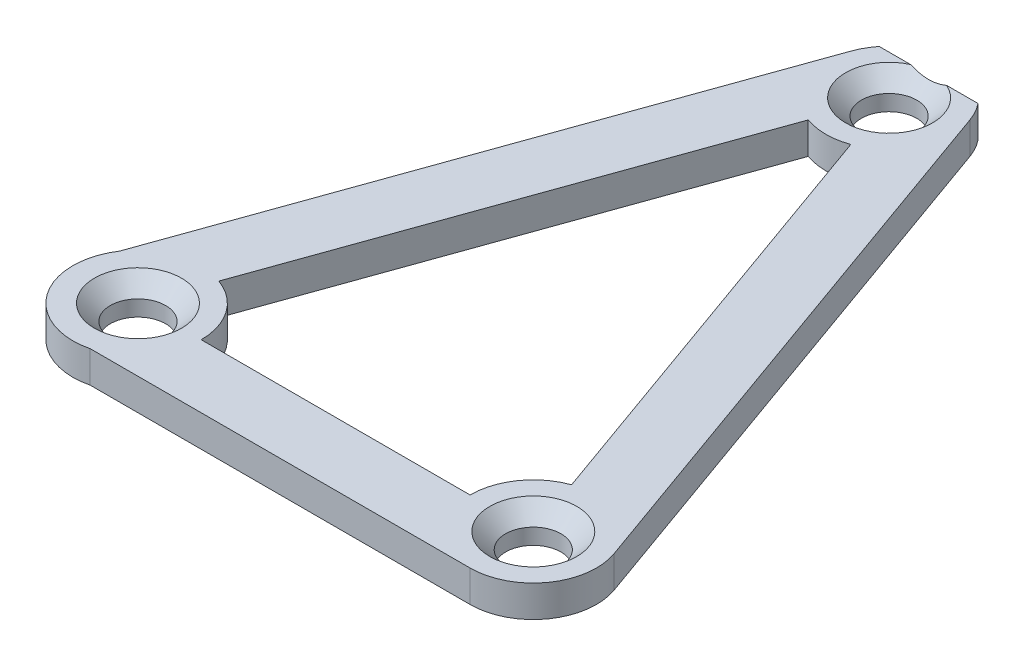
ISO-10303-21;
HEADER;
FILE_DESCRIPTION(('STEP AP214'),'2;1');
FILE_NAME('part.step','',(''),(''),'','','');
FILE_SCHEMA(('AUTOMOTIVE_DESIGN { 1 0 10303 214 1 1 1 1 }'));
ENDSEC;
DATA;
#1=APPLICATION_CONTEXT('core data for automotive mechanical design processes');
#2=APPLICATION_PROTOCOL_DEFINITION('international standard','automotive_design',2000,#1);
#3=PRODUCT_CONTEXT('',#1,'mechanical');
#4=PRODUCT('Part','Part','',(#3));
#5=PRODUCT_RELATED_PRODUCT_CATEGORY('part','',(#4));
#6=PRODUCT_DEFINITION_FORMATION('','',#4);
#7=PRODUCT_DEFINITION_CONTEXT('part definition',#1,'design');
#8=PRODUCT_DEFINITION('design','',#6,#7);
#9=PRODUCT_DEFINITION_SHAPE('','',#8);
#10=(LENGTH_UNIT() NAMED_UNIT(*) SI_UNIT(.MILLI.,.METRE.));
#11=(NAMED_UNIT(*) PLANE_ANGLE_UNIT() SI_UNIT($,.RADIAN.));
#12=(NAMED_UNIT(*) SI_UNIT($,.STERADIAN.) SOLID_ANGLE_UNIT());
#13=UNCERTAINTY_MEASURE_WITH_UNIT(LENGTH_MEASURE(1.E-05),#10,'distance_accuracy_value','');
#14=(GEOMETRIC_REPRESENTATION_CONTEXT(3) GLOBAL_UNCERTAINTY_ASSIGNED_CONTEXT((#13)) GLOBAL_UNIT_ASSIGNED_CONTEXT((#10,
#11,#12)) REPRESENTATION_CONTEXT('',''));
#15=CARTESIAN_POINT('',(0.,0.,0.));
#16=DIRECTION('',(0.,0.,1.));
#17=DIRECTION('',(1.,0.,0.));
#18=AXIS2_PLACEMENT_3D('',#15,#16,#17);
#19=CARTESIAN_POINT('',(15.8884942729655,2.,-41.3048119431263));
#20=DIRECTION('',(0.,-1.,0.));
#21=DIRECTION('',(0.,0.,-1.));
#22=AXIS2_PLACEMENT_3D('',#19,#20,#21);
#23=CYLINDRICAL_SURFACE('',#22,4.);
#24=CARTESIAN_POINT('',(15.8884942729655,0.,-41.3048119431263));
#25=DIRECTION('',(0.,1.,0.));
#26=DIRECTION('',(0.,0.,1.));
#27=AXIS2_PLACEMENT_3D('',#24,#25,#26);
#28=CIRCLE('',#27,4.);
#29=CARTESIAN_POINT('',(19.6554619193448,0.,-42.6501575311189));
#30=VERTEX_POINT('',#29);
#31=CARTESIAN_POINT('',(19.0109932721647,0.,-43.8048119431263));
#32=VERTEX_POINT('',#31);
#33=EDGE_CURVE('E188',#30,#32,#28,.T.);
#34=ORIENTED_EDGE('',*,*,#33,.T.);
#35=DIRECTION('',(0.,-1.,0.));
#36=VECTOR('',#35,1.);
#37=CARTESIAN_POINT('',(19.0109932721647,2.,-43.8048119431263));
#38=LINE('',#37,#36);
#39=CARTESIAN_POINT('',(19.0109932721647,2.,-43.8048119431263));
#40=VERTEX_POINT('',#39);
#41=EDGE_CURVE('E159',#32,#40,#38,.F.);
#42=ORIENTED_EDGE('',*,*,#41,.T.);
#43=CARTESIAN_POINT('',(15.8884942729655,2.,-41.3048119431263));
#44=DIRECTION('',(0.,1.,0.));
#45=DIRECTION('',(0.,0.,1.));
#46=AXIS2_PLACEMENT_3D('',#43,#44,#45);
#47=CIRCLE('',#46,4.);
#48=CARTESIAN_POINT('',(19.6554619193448,2.,-42.6501575311189));
#49=VERTEX_POINT('',#48);
#50=EDGE_CURVE('E166',#49,#40,#47,.T.);
#51=ORIENTED_EDGE('',*,*,#50,.F.);
#52=DIRECTION('',(0.,-1.,0.));
#53=VECTOR('',#52,1.);
#54=CARTESIAN_POINT('',(19.6554619193448,2.,-42.6501575311189));
#55=LINE('',#54,#53);
#56=EDGE_CURVE('E206',#49,#30,#55,.T.);
#57=ORIENTED_EDGE('',*,*,#56,.T.);
#58=EDGE_LOOP('',(#34,#42,#51,#57));
#59=FACE_BOUND('',#58,.T.);
#60=ADVANCED_FACE('F32',(#59),#23,.T.);
#61=CARTESIAN_POINT('',(28.3884942729655,2.,-6.30481194312627));
#62=DIRECTION('',(0.,1.,0.));
#63=DIRECTION('',(0.,0.,1.));
#64=AXIS2_PLACEMENT_3D('',#61,#62,#63);
#65=PLANE('',#64);
#66=DIRECTION('',(1.,0.,0.));
#67=VECTOR('',#66,1.);
#68=CARTESIAN_POINT('',(20.8884942729655,2.,-43.8048119431263));
#69=LINE('',#68,#67);
#70=CARTESIAN_POINT('',(12.7659952737663,2.,-43.8048119431263));
#71=VERTEX_POINT('',#70);
#72=CARTESIAN_POINT('',(14.7428503492265,2.,-43.8048119431263));
#73=VERTEX_POINT('',#72);
#74=EDGE_CURVE('E51',#71,#73,#69,.T.);
#75=ORIENTED_EDGE('',*,*,#74,.F.);
#76=CARTESIAN_POINT('',(12.1215266265861,2.,-42.6501575311189));
#77=VERTEX_POINT('',#76);
#78=EDGE_CURVE('E154',#71,#77,#47,.T.);
#79=ORIENTED_EDGE('',*,*,#78,.T.);
#80=DIRECTION('',(-0.336336396998156,0.,0.941741911594838));
#81=VECTOR('',#80,1.);
#82=CARTESIAN_POINT('',(-0.0497651199511386,2.,-8.5705406408145));
#83=LINE('',#82,#81);
#84=CARTESIAN_POINT('',(-0.0497651199511395,2.,-8.5705406408145));
#85=VERTEX_POINT('',#84);
#86=EDGE_CURVE('E170',#77,#85,#83,.T.);
#87=ORIENTED_EDGE('',*,*,#86,.T.);
#88=CARTESIAN_POINT('',(3.38849427296549,2.,-6.30481194312627));
#89=DIRECTION('',(0.,1.,0.));
#90=DIRECTION('',(0.,0.,1.));
#91=AXIS2_PLACEMENT_3D('',#88,#89,#90);
#92=CIRCLE('',#91,4.11766368035412);
#93=CARTESIAN_POINT('',(4.36581417172305,2.,-2.30481194312627));
#94=VERTEX_POINT('',#93);
#95=EDGE_CURVE('E176',#85,#94,#92,.T.);
#96=ORIENTED_EDGE('',*,*,#95,.T.);
#97=DIRECTION('',(1.,0.,0.));
#98=VECTOR('',#97,1.);
#99=CARTESIAN_POINT('',(28.3884942729655,2.,-2.30481194312628));
#100=LINE('',#99,#98);
#101=CARTESIAN_POINT('',(28.3884942729655,2.,-2.30481194312628));
#102=VERTEX_POINT('',#101);
#103=EDGE_CURVE('E178',#94,#102,#100,.T.);
#104=ORIENTED_EDGE('',*,*,#103,.T.);
#105=CARTESIAN_POINT('',(28.3884942729655,2.,-6.30481194312627));
#106=DIRECTION('',(0.,1.,0.));
#107=DIRECTION('',(0.,0.,1.));
#108=AXIS2_PLACEMENT_3D('',#105,#106,#107);
#109=CIRCLE('',#108,4.);
#110=CARTESIAN_POINT('',(32.1554619193448,2.,-7.65015753111889));
#111=VERTEX_POINT('',#110);
#112=EDGE_CURVE('E171',#102,#111,#109,.T.);
#113=ORIENTED_EDGE('',*,*,#112,.T.);
#114=DIRECTION('',(-0.336336396998156,0.,-0.941741911594838));
#115=VECTOR('',#114,1.);
#116=CARTESIAN_POINT('',(19.6554619193448,2.,-42.6501575311189));
#117=LINE('',#116,#115);
#118=EDGE_CURVE('E167',#111,#49,#117,.T.);
#119=ORIENTED_EDGE('',*,*,#118,.T.);
#120=ORIENTED_EDGE('',*,*,#50,.T.);
#121=CARTESIAN_POINT('',(17.0341381967045,2.,-43.8048119431263));
#122=VERTEX_POINT('',#121);
#123=EDGE_CURVE('E160',#122,#40,#69,.T.);
#124=ORIENTED_EDGE('',*,*,#123,.F.);
#125=CARTESIAN_POINT('',(15.8884942729655,2.,-41.3048119431263));
#126=DIRECTION('',(0.,1.,0.));
#127=DIRECTION('',(0.,0.,1.));
#128=AXIS2_PLACEMENT_3D('',#125,#126,#127);
#129=CIRCLE('',#128,2.75000000000002);
#130=EDGE_CURVE('E158',#122,#73,#129,.F.);
#131=ORIENTED_EDGE('',*,*,#130,.T.);
#132=EDGE_LOOP('',(#75,#79,#87,#96,#104,#113,#119,#120,#124,#131));
#133=FACE_BOUND('',#132,.T.);
#134=CARTESIAN_POINT('',(3.38849427296549,2.,-6.30481194312627));
#135=DIRECTION('',(0.,1.,0.));
#136=DIRECTION('',(0.,0.,1.));
#137=AXIS2_PLACEMENT_3D('',#134,#135,#136);
#138=CIRCLE('',#137,2.75000000000002);
#139=CARTESIAN_POINT('',(3.38849427296549,2.,-3.55481194312626));
#140=VERTEX_POINT('',#139);
#141=EDGE_CURVE('E218',#140,#140,#138,.F.);
#142=ORIENTED_EDGE('',*,*,#141,.T.);
#143=EDGE_LOOP('',(#142));
#144=FACE_BOUND('',#143,.T.);
#145=CARTESIAN_POINT('',(28.3884942729655,2.,-6.30481194312627));
#146=DIRECTION('',(0.,1.,0.));
#147=DIRECTION('',(0.,0.,1.));
#148=AXIS2_PLACEMENT_3D('',#145,#146,#147);
#149=CIRCLE('',#148,2.75000000000002);
#150=CARTESIAN_POINT('',(28.3884942729655,2.,-3.55481194312626));
#151=VERTEX_POINT('',#150);
#152=EDGE_CURVE('E215',#151,#151,#149,.F.);
#153=ORIENTED_EDGE('',*,*,#152,.T.);
#154=EDGE_LOOP('',(#153));
#155=FACE_BOUND('',#154,.T.);
#156=DIRECTION('',(-0.336336396998156,0.,0.941741911594837));
#157=VECTOR('',#156,1.);
#158=CARTESIAN_POINT('',(14.5431486849729,2.,-37.5378442967469));
#159=LINE('',#158,#157);
#160=CARTESIAN_POINT('',(14.5431486849729,2.,-37.5378442967469));
#161=VERTEX_POINT('',#160);
#162=CARTESIAN_POINT('',(4.73383986095812,2.,-10.0717795895056));
#163=VERTEX_POINT('',#162);
#164=EDGE_CURVE('E313',#161,#163,#159,.T.);
#165=ORIENTED_EDGE('',*,*,#164,.F.);
#166=CARTESIAN_POINT('',(15.8884942729655,2.,-41.3048119431263));
#167=DIRECTION('',(0.,-1.,0.));
#168=DIRECTION('',(0.,0.,1.));
#169=AXIS2_PLACEMENT_3D('',#166,#167,#168);
#170=CIRCLE('',#169,4.);
#171=CARTESIAN_POINT('',(17.2338398609581,2.,-37.5378442967469));
#172=VERTEX_POINT('',#171);
#173=EDGE_CURVE('E311',#172,#161,#170,.T.);
#174=ORIENTED_EDGE('',*,*,#173,.F.);
#175=DIRECTION('',(-0.336336396998156,0.,-0.941741911594837));
#176=VECTOR('',#175,1.);
#177=CARTESIAN_POINT('',(17.2338398609581,2.,-37.5378442967469));
#178=LINE('',#177,#176);
#179=CARTESIAN_POINT('',(27.0431486849729,2.,-10.0717795895056));
#180=VERTEX_POINT('',#179);
#181=EDGE_CURVE('E322',#180,#172,#178,.T.);
#182=ORIENTED_EDGE('',*,*,#181,.F.);
#183=CARTESIAN_POINT('',(28.3884942729655,2.,-6.30481194312627));
#184=DIRECTION('',(0.,-1.,0.));
#185=DIRECTION('',(0.,0.,1.));
#186=AXIS2_PLACEMENT_3D('',#183,#184,#185);
#187=CIRCLE('',#186,4.);
#188=CARTESIAN_POINT('',(24.3884942729655,2.,-6.30481194312628));
#189=VERTEX_POINT('',#188);
#190=EDGE_CURVE('E320',#189,#180,#187,.T.);
#191=ORIENTED_EDGE('',*,*,#190,.F.);
#192=DIRECTION('',(1.,0.,0.));
#193=VECTOR('',#192,1.);
#194=CARTESIAN_POINT('',(7.38849427296549,2.,-6.30481194312628));
#195=LINE('',#194,#193);
#196=CARTESIAN_POINT('',(7.38849427296549,2.,-6.30481194312628));
#197=VERTEX_POINT('',#196);
#198=EDGE_CURVE('E318',#197,#189,#195,.T.);
#199=ORIENTED_EDGE('',*,*,#198,.F.);
#200=CARTESIAN_POINT('',(3.38849427296549,2.,-6.30481194312627));
#201=DIRECTION('',(0.,-1.,0.));
#202=DIRECTION('',(0.,0.,1.));
#203=AXIS2_PLACEMENT_3D('',#200,#201,#202);
#204=CIRCLE('',#203,4.);
#205=EDGE_CURVE('E316',#163,#197,#204,.T.);
#206=ORIENTED_EDGE('',*,*,#205,.F.);
#207=EDGE_LOOP('',(#165,#174,#182,#191,#199,#206));
#208=FACE_BOUND('',#207,.T.);
#209=ADVANCED_FACE('F152',(#133,#144,#155,#208),#65,.T.);
#210=CARTESIAN_POINT('',(28.3884942729655,0.,-6.30481194312627));
#211=DIRECTION('',(0.,1.,0.));
#212=DIRECTION('',(0.,0.,1.));
#213=AXIS2_PLACEMENT_3D('',#210,#211,#212);
#214=PLANE('',#213);
#215=CARTESIAN_POINT('',(15.8884942729655,0.,-41.3048119431263));
#216=DIRECTION('',(0.,1.,0.));
#217=DIRECTION('',(0.,0.,1.));
#218=AXIS2_PLACEMENT_3D('',#215,#216,#217);
#219=CIRCLE('',#218,1.75);
#220=CARTESIAN_POINT('',(15.8884942729655,0.,-39.5548119431263));
#221=VERTEX_POINT('',#220);
#222=EDGE_CURVE('E285',#221,#221,#219,.T.);
#223=ORIENTED_EDGE('',*,*,#222,.T.);
#224=EDGE_LOOP('',(#223));
#225=FACE_BOUND('',#224,.T.);
#226=CARTESIAN_POINT('',(28.3884942729655,0.,-6.30481194312627));
#227=DIRECTION('',(0.,1.,0.));
#228=DIRECTION('',(0.,0.,1.));
#229=AXIS2_PLACEMENT_3D('',#226,#227,#228);
#230=CIRCLE('',#229,1.75);
#231=CARTESIAN_POINT('',(28.3884942729655,0.,-4.55481194312627));
#232=VERTEX_POINT('',#231);
#233=EDGE_CURVE('E287',#232,#232,#230,.T.);
#234=ORIENTED_EDGE('',*,*,#233,.T.);
#235=EDGE_LOOP('',(#234));
#236=FACE_BOUND('',#235,.T.);
#237=CARTESIAN_POINT('',(3.38849427296549,0.,-6.30481194312627));
#238=DIRECTION('',(0.,1.,0.));
#239=DIRECTION('',(0.,0.,1.));
#240=AXIS2_PLACEMENT_3D('',#237,#238,#239);
#241=CIRCLE('',#240,1.75);
#242=CARTESIAN_POINT('',(3.38849427296549,0.,-4.55481194312627));
#243=VERTEX_POINT('',#242);
#244=EDGE_CURVE('E185',#243,#243,#241,.T.);
#245=ORIENTED_EDGE('',*,*,#244,.T.);
#246=EDGE_LOOP('',(#245));
#247=FACE_BOUND('',#246,.T.);
#248=CARTESIAN_POINT('',(12.7659952737663,0.,-43.8048119431263));
#249=VERTEX_POINT('',#248);
#250=CARTESIAN_POINT('',(12.1215266265861,0.,-42.6501575311189));
#251=VERTEX_POINT('',#250);
#252=EDGE_CURVE('E187',#249,#251,#28,.T.);
#253=ORIENTED_EDGE('',*,*,#252,.F.);
#254=DIRECTION('',(1.,0.,0.));
#255=VECTOR('',#254,1.);
#256=CARTESIAN_POINT('',(28.3884942729655,0.,-43.8048119431263));
#257=LINE('',#256,#255);
#258=EDGE_CURVE('E144',#249,#32,#257,.T.);
#259=ORIENTED_EDGE('',*,*,#258,.T.);
#260=ORIENTED_EDGE('',*,*,#33,.F.);
#261=DIRECTION('',(-0.336336396998156,0.,-0.941741911594838));
#262=VECTOR('',#261,1.);
#263=CARTESIAN_POINT('',(19.6554619193448,0.,-42.6501575311189));
#264=LINE('',#263,#262);
#265=CARTESIAN_POINT('',(32.1554619193448,0.,-7.65015753111889));
#266=VERTEX_POINT('',#265);
#267=EDGE_CURVE('E184',#266,#30,#264,.T.);
#268=ORIENTED_EDGE('',*,*,#267,.F.);
#269=CARTESIAN_POINT('',(28.3884942729655,0.,-6.30481194312627));
#270=DIRECTION('',(0.,1.,0.));
#271=DIRECTION('',(0.,0.,1.));
#272=AXIS2_PLACEMENT_3D('',#269,#270,#271);
#273=CIRCLE('',#272,4.);
#274=CARTESIAN_POINT('',(28.3884942729655,0.,-2.30481194312628));
#275=VERTEX_POINT('',#274);
#276=EDGE_CURVE('E181',#275,#266,#273,.T.);
#277=ORIENTED_EDGE('',*,*,#276,.F.);
#278=DIRECTION('',(1.,0.,0.));
#279=VECTOR('',#278,1.);
#280=CARTESIAN_POINT('',(28.3884942729655,0.,-2.30481194312628));
#281=LINE('',#280,#279);
#282=CARTESIAN_POINT('',(4.36581417172305,0.,-2.30481194312627));
#283=VERTEX_POINT('',#282);
#284=EDGE_CURVE('E195',#283,#275,#281,.T.);
#285=ORIENTED_EDGE('',*,*,#284,.F.);
#286=CARTESIAN_POINT('',(3.38849427296549,0.,-6.30481194312627));
#287=DIRECTION('',(0.,1.,0.));
#288=DIRECTION('',(0.,0.,1.));
#289=AXIS2_PLACEMENT_3D('',#286,#287,#288);
#290=CIRCLE('',#289,4.11766368035412);
#291=CARTESIAN_POINT('',(-0.0497651199511395,0.,-8.5705406408145));
#292=VERTEX_POINT('',#291);
#293=EDGE_CURVE('E193',#292,#283,#290,.T.);
#294=ORIENTED_EDGE('',*,*,#293,.F.);
#295=DIRECTION('',(-0.336336396998156,0.,0.941741911594838));
#296=VECTOR('',#295,1.);
#297=CARTESIAN_POINT('',(-0.0497651199511386,0.,-8.5705406408145));
#298=LINE('',#297,#296);
#299=EDGE_CURVE('E191',#251,#292,#298,.T.);
#300=ORIENTED_EDGE('',*,*,#299,.F.);
#301=EDGE_LOOP('',(#253,#259,#260,#268,#277,#285,#294,#300));
#302=FACE_BOUND('',#301,.T.);
#303=CARTESIAN_POINT('',(15.8884942729655,0.,-41.3048119431263));
#304=DIRECTION('',(0.,-1.,0.));
#305=DIRECTION('',(0.,0.,1.));
#306=AXIS2_PLACEMENT_3D('',#303,#304,#305);
#307=CIRCLE('',#306,4.);
#308=CARTESIAN_POINT('',(17.2338398609581,0.,-37.5378442967469));
#309=VERTEX_POINT('',#308);
#310=CARTESIAN_POINT('',(14.5431486849729,0.,-37.5378442967469));
#311=VERTEX_POINT('',#310);
#312=EDGE_CURVE('E148',#309,#311,#307,.T.);
#313=ORIENTED_EDGE('',*,*,#312,.T.);
#314=DIRECTION('',(-0.336336396998156,0.,0.941741911594837));
#315=VECTOR('',#314,1.);
#316=CARTESIAN_POINT('',(14.5431486849729,0.,-37.5378442967469));
#317=LINE('',#316,#315);
#318=CARTESIAN_POINT('',(4.73383986095812,0.,-10.0717795895056));
#319=VERTEX_POINT('',#318);
#320=EDGE_CURVE('E327',#311,#319,#317,.T.);
#321=ORIENTED_EDGE('',*,*,#320,.T.);
#322=CARTESIAN_POINT('',(3.38849427296549,0.,-6.30481194312627));
#323=DIRECTION('',(0.,-1.,0.));
#324=DIRECTION('',(0.,0.,1.));
#325=AXIS2_PLACEMENT_3D('',#322,#323,#324);
#326=CIRCLE('',#325,4.);
#327=CARTESIAN_POINT('',(7.38849427296549,0.,-6.30481194312628));
#328=VERTEX_POINT('',#327);
#329=EDGE_CURVE('E330',#319,#328,#326,.T.);
#330=ORIENTED_EDGE('',*,*,#329,.T.);
#331=DIRECTION('',(1.,0.,0.));
#332=VECTOR('',#331,1.);
#333=CARTESIAN_POINT('',(7.38849427296549,0.,-6.30481194312628));
#334=LINE('',#333,#332);
#335=CARTESIAN_POINT('',(24.3884942729655,0.,-6.30481194312628));
#336=VERTEX_POINT('',#335);
#337=EDGE_CURVE('E333',#328,#336,#334,.T.);
#338=ORIENTED_EDGE('',*,*,#337,.T.);
#339=CARTESIAN_POINT('',(28.3884942729655,0.,-6.30481194312627));
#340=DIRECTION('',(0.,-1.,0.));
#341=DIRECTION('',(0.,0.,1.));
#342=AXIS2_PLACEMENT_3D('',#339,#340,#341);
#343=CIRCLE('',#342,4.);
#344=CARTESIAN_POINT('',(27.0431486849729,0.,-10.0717795895056));
#345=VERTEX_POINT('',#344);
#346=EDGE_CURVE('E336',#336,#345,#343,.T.);
#347=ORIENTED_EDGE('',*,*,#346,.T.);
#348=DIRECTION('',(-0.336336396998156,0.,-0.941741911594837));
#349=VECTOR('',#348,1.);
#350=CARTESIAN_POINT('',(17.2338398609581,0.,-37.5378442967469));
#351=LINE('',#350,#349);
#352=EDGE_CURVE('E314',#345,#309,#351,.T.);
#353=ORIENTED_EDGE('',*,*,#352,.T.);
#354=EDGE_LOOP('',(#313,#321,#330,#338,#347,#353));
#355=FACE_BOUND('',#354,.T.);
#356=ADVANCED_FACE('F246',(#225,#236,#247,#302,#355),#214,.F.);
#357=CARTESIAN_POINT('',(28.3884942729655,2.,-6.30481194312627));
#358=DIRECTION('',(0.,-1.,0.));
#359=DIRECTION('',(0.,0.,-1.));
#360=AXIS2_PLACEMENT_3D('',#357,#358,#359);
#361=CYLINDRICAL_SURFACE('',#360,4.);
#362=ORIENTED_EDGE('',*,*,#276,.T.);
#363=DIRECTION('',(0.,-1.,0.));
#364=VECTOR('',#363,1.);
#365=CARTESIAN_POINT('',(32.1554619193448,2.,-7.65015753111889));
#366=LINE('',#365,#364);
#367=EDGE_CURVE('E209',#111,#266,#366,.T.);
#368=ORIENTED_EDGE('',*,*,#367,.F.);
#369=ORIENTED_EDGE('',*,*,#112,.F.);
#370=DIRECTION('',(0.,-1.,0.));
#371=VECTOR('',#370,1.);
#372=CARTESIAN_POINT('',(28.3884942729655,2.,-2.30481194312628));
#373=LINE('',#372,#371);
#374=EDGE_CURVE('E180',#102,#275,#373,.T.);
#375=ORIENTED_EDGE('',*,*,#374,.T.);
#376=EDGE_LOOP('',(#362,#368,#369,#375));
#377=FACE_BOUND('',#376,.T.);
#378=ADVANCED_FACE('F259',(#377),#361,.T.);
#379=CARTESIAN_POINT('',(19.6554619193448,2.,-42.6501575311189));
#380=DIRECTION('',(-0.941741911594838,0.,0.336336396998156));
#381=DIRECTION('',(0.336336396998156,0.,0.941741911594838));
#382=AXIS2_PLACEMENT_3D('',#379,#380,#381);
#383=PLANE('',#382);
#384=ORIENTED_EDGE('',*,*,#267,.T.);
#385=ORIENTED_EDGE('',*,*,#56,.F.);
#386=ORIENTED_EDGE('',*,*,#118,.F.);
#387=ORIENTED_EDGE('',*,*,#367,.T.);
#388=EDGE_LOOP('',(#384,#385,#386,#387));
#389=FACE_BOUND('',#388,.T.);
#390=ADVANCED_FACE('F252',(#389),#383,.F.);
#391=ORIENTED_EDGE('',*,*,#78,.F.);
#392=DIRECTION('',(0.,-1.,0.));
#393=VECTOR('',#392,1.);
#394=CARTESIAN_POINT('',(12.7659952737663,2.,-43.8048119431263));
#395=LINE('',#394,#393);
#396=EDGE_CURVE('E141',#71,#249,#395,.T.);
#397=ORIENTED_EDGE('',*,*,#396,.T.);
#398=ORIENTED_EDGE('',*,*,#252,.T.);
#399=DIRECTION('',(0.,-1.,0.));
#400=VECTOR('',#399,1.);
#401=CARTESIAN_POINT('',(12.1215266265861,2.,-42.6501575311189));
#402=LINE('',#401,#400);
#403=EDGE_CURVE('E164',#77,#251,#402,.T.);
#404=ORIENTED_EDGE('',*,*,#403,.F.);
#405=EDGE_LOOP('',(#391,#397,#398,#404));
#406=FACE_BOUND('',#405,.T.);
#407=ADVANCED_FACE('F162',(#406),#23,.T.);
#408=CARTESIAN_POINT('',(-0.0497651199511386,2.,-8.5705406408145));
#409=DIRECTION('',(0.941741911594838,0.,0.336336396998156));
#410=DIRECTION('',(0.336336396998156,0.,-0.941741911594838));
#411=AXIS2_PLACEMENT_3D('',#408,#409,#410);
#412=PLANE('',#411);
#413=ORIENTED_EDGE('',*,*,#299,.T.);
#414=DIRECTION('',(0.,-1.,0.));
#415=VECTOR('',#414,1.);
#416=CARTESIAN_POINT('',(-0.0497651199511395,2.,-8.5705406408145));
#417=LINE('',#416,#415);
#418=EDGE_CURVE('E202',#85,#292,#417,.T.);
#419=ORIENTED_EDGE('',*,*,#418,.F.);
#420=ORIENTED_EDGE('',*,*,#86,.F.);
#421=ORIENTED_EDGE('',*,*,#403,.T.);
#422=EDGE_LOOP('',(#413,#419,#420,#421));
#423=FACE_BOUND('',#422,.T.);
#424=ADVANCED_FACE('F251',(#423),#412,.F.);
#425=CARTESIAN_POINT('',(3.38849427296549,2.,-6.30481194312627));
#426=DIRECTION('',(0.,-1.,0.));
#427=DIRECTION('',(0.,0.,-1.));
#428=AXIS2_PLACEMENT_3D('',#425,#426,#427);
#429=CYLINDRICAL_SURFACE('',#428,4.11766368035412);
#430=ORIENTED_EDGE('',*,*,#293,.T.);
#431=DIRECTION('',(0.,-1.,0.));
#432=VECTOR('',#431,1.);
#433=CARTESIAN_POINT('',(4.36581417172305,2.,-2.30481194312627));
#434=LINE('',#433,#432);
#435=EDGE_CURVE('E199',#94,#283,#434,.T.);
#436=ORIENTED_EDGE('',*,*,#435,.F.);
#437=ORIENTED_EDGE('',*,*,#95,.F.);
#438=ORIENTED_EDGE('',*,*,#418,.T.);
#439=EDGE_LOOP('',(#430,#436,#437,#438));
#440=FACE_BOUND('',#439,.T.);
#441=ADVANCED_FACE('F257',(#440),#429,.T.);
#442=CARTESIAN_POINT('',(28.3884942729655,2.,-2.30481194312628));
#443=DIRECTION('',(0.,0.,-1.));
#444=DIRECTION('',(-1.,0.,0.));
#445=AXIS2_PLACEMENT_3D('',#442,#443,#444);
#446=PLANE('',#445);
#447=ORIENTED_EDGE('',*,*,#284,.T.);
#448=ORIENTED_EDGE('',*,*,#374,.F.);
#449=ORIENTED_EDGE('',*,*,#103,.F.);
#450=ORIENTED_EDGE('',*,*,#435,.T.);
#451=EDGE_LOOP('',(#447,#448,#449,#450));
#452=FACE_BOUND('',#451,.T.);
#453=ADVANCED_FACE('F388',(#452),#446,.F.);
#454=CARTESIAN_POINT('',(3.38849427296549,2.,-6.30481194312627));
#455=DIRECTION('',(0.,-1.,0.));
#456=DIRECTION('',(0.,0.,-1.));
#457=AXIS2_PLACEMENT_3D('',#454,#455,#456);
#458=CYLINDRICAL_SURFACE('',#457,1.75);
#459=CARTESIAN_POINT('',(3.38849427296549,0.999999999999991,-6.30481194312627));
#460=DIRECTION('',(0.,1.,0.));
#461=DIRECTION('',(0.,0.,1.));
#462=AXIS2_PLACEMENT_3D('',#459,#460,#461);
#463=CIRCLE('',#462,1.75);
#464=CARTESIAN_POINT('',(3.38849427296549,0.999999999999991,-4.55481194312627));
#465=VERTEX_POINT('',#464);
#466=EDGE_CURVE('E222',#465,#465,#463,.T.);
#467=ORIENTED_EDGE('',*,*,#466,.T.);
#468=EDGE_LOOP('',(#467));
#469=FACE_BOUND('',#468,.T.);
#470=ORIENTED_EDGE('',*,*,#244,.F.);
#471=EDGE_LOOP('',(#470));
#472=FACE_BOUND('',#471,.T.);
#473=ADVANCED_FACE('F386',(#469,#472),#458,.F.);
#474=CARTESIAN_POINT('',(28.3884942729655,2.,-6.30481194312627));
#475=DIRECTION('',(0.,-1.,0.));
#476=DIRECTION('',(0.,0.,-1.));
#477=AXIS2_PLACEMENT_3D('',#474,#475,#476);
#478=CYLINDRICAL_SURFACE('',#477,1.75);
#479=CARTESIAN_POINT('',(28.3884942729655,0.999999999999992,-6.30481194312627));
#480=DIRECTION('',(0.,1.,0.));
#481=DIRECTION('',(0.,0.,1.));
#482=AXIS2_PLACEMENT_3D('',#479,#480,#481);
#483=CIRCLE('',#482,1.75);
#484=CARTESIAN_POINT('',(28.3884942729655,0.999999999999992,-4.55481194312627));
#485=VERTEX_POINT('',#484);
#486=EDGE_CURVE('E45',#485,#485,#483,.T.);
#487=ORIENTED_EDGE('',*,*,#486,.T.);
#488=EDGE_LOOP('',(#487));
#489=FACE_BOUND('',#488,.T.);
#490=ORIENTED_EDGE('',*,*,#233,.F.);
#491=EDGE_LOOP('',(#490));
#492=FACE_BOUND('',#491,.T.);
#493=ADVANCED_FACE('F227',(#489,#492),#478,.F.);
#494=CARTESIAN_POINT('',(15.8884942729655,2.,-41.3048119431263));
#495=DIRECTION('',(0.,-1.,0.));
#496=DIRECTION('',(0.,0.,-1.));
#497=AXIS2_PLACEMENT_3D('',#494,#495,#496);
#498=CYLINDRICAL_SURFACE('',#497,1.75);
#499=CARTESIAN_POINT('',(15.8884942729655,0.999999999999978,-41.3048119431263));
#500=DIRECTION('',(0.,1.,0.));
#501=DIRECTION('',(0.,0.,1.));
#502=AXIS2_PLACEMENT_3D('',#499,#500,#501);
#503=CIRCLE('',#502,1.75);
#504=CARTESIAN_POINT('',(15.8884942729655,0.999999999999978,-39.5548119431263));
#505=VERTEX_POINT('',#504);
#506=EDGE_CURVE('E212',#505,#505,#503,.T.);
#507=ORIENTED_EDGE('',*,*,#506,.T.);
#508=EDGE_LOOP('',(#507));
#509=FACE_BOUND('',#508,.T.);
#510=ORIENTED_EDGE('',*,*,#222,.F.);
#511=EDGE_LOOP('',(#510));
#512=FACE_BOUND('',#511,.T.);
#513=ADVANCED_FACE('F278',(#509,#512),#498,.F.);
#514=CARTESIAN_POINT('',(15.8884942729655,2.,-41.3048119431263));
#515=DIRECTION('',(0.,-1.,0.));
#516=DIRECTION('',(0.,0.,-1.));
#517=AXIS2_PLACEMENT_3D('',#514,#515,#516);
#518=CYLINDRICAL_SURFACE('',#517,4.);
#519=ORIENTED_EDGE('',*,*,#312,.F.);
#520=DIRECTION('',(0.,-1.,0.));
#521=VECTOR('',#520,1.);
#522=CARTESIAN_POINT('',(17.2338398609581,2.,-37.5378442967469));
#523=LINE('',#522,#521);
#524=EDGE_CURVE('E324',#172,#309,#523,.T.);
#525=ORIENTED_EDGE('',*,*,#524,.F.);
#526=ORIENTED_EDGE('',*,*,#173,.T.);
#527=DIRECTION('',(0.,-1.,0.));
#528=VECTOR('',#527,1.);
#529=CARTESIAN_POINT('',(14.5431486849729,2.,-37.5378442967469));
#530=LINE('',#529,#528);
#531=EDGE_CURVE('E288',#161,#311,#530,.T.);
#532=ORIENTED_EDGE('',*,*,#531,.T.);
#533=EDGE_LOOP('',(#519,#525,#526,#532));
#534=FACE_BOUND('',#533,.T.);
#535=ADVANCED_FACE('F281',(#534),#518,.T.);
#536=CARTESIAN_POINT('',(14.5431486849729,2.,-37.5378442967469));
#537=DIRECTION('',(0.941741911594838,0.,0.336336396998156));
#538=DIRECTION('',(0.336336396998156,0.,-0.941741911594838));
#539=AXIS2_PLACEMENT_3D('',#536,#537,#538);
#540=PLANE('',#539);
#541=ORIENTED_EDGE('',*,*,#320,.F.);
#542=ORIENTED_EDGE('',*,*,#531,.F.);
#543=ORIENTED_EDGE('',*,*,#164,.T.);
#544=DIRECTION('',(0.,-1.,0.));
#545=VECTOR('',#544,1.);
#546=CARTESIAN_POINT('',(4.73383986095812,2.,-10.0717795895056));
#547=LINE('',#546,#545);
#548=EDGE_CURVE('E293',#163,#319,#547,.T.);
#549=ORIENTED_EDGE('',*,*,#548,.T.);
#550=EDGE_LOOP('',(#541,#542,#543,#549));
#551=FACE_BOUND('',#550,.T.);
#552=ADVANCED_FACE('F350',(#551),#540,.T.);
#553=CARTESIAN_POINT('',(3.38849427296549,2.,-6.30481194312627));
#554=DIRECTION('',(0.,-1.,0.));
#555=DIRECTION('',(0.,0.,-1.));
#556=AXIS2_PLACEMENT_3D('',#553,#554,#555);
#557=CYLINDRICAL_SURFACE('',#556,4.);
#558=ORIENTED_EDGE('',*,*,#329,.F.);
#559=ORIENTED_EDGE('',*,*,#548,.F.);
#560=ORIENTED_EDGE('',*,*,#205,.T.);
#561=DIRECTION('',(0.,-1.,0.));
#562=VECTOR('',#561,1.);
#563=CARTESIAN_POINT('',(7.38849427296549,2.,-6.30481194312628));
#564=LINE('',#563,#562);
#565=EDGE_CURVE('E346',#197,#328,#564,.T.);
#566=ORIENTED_EDGE('',*,*,#565,.T.);
#567=EDGE_LOOP('',(#558,#559,#560,#566));
#568=FACE_BOUND('',#567,.T.);
#569=ADVANCED_FACE('F355',(#568),#557,.T.);
#570=CARTESIAN_POINT('',(7.38849427296549,2.,-6.30481194312628));
#571=DIRECTION('',(0.,0.,-1.));
#572=DIRECTION('',(-1.,0.,0.));
#573=AXIS2_PLACEMENT_3D('',#570,#571,#572);
#574=PLANE('',#573);
#575=ORIENTED_EDGE('',*,*,#337,.F.);
#576=ORIENTED_EDGE('',*,*,#565,.F.);
#577=ORIENTED_EDGE('',*,*,#198,.T.);
#578=DIRECTION('',(0.,-1.,0.));
#579=VECTOR('',#578,1.);
#580=CARTESIAN_POINT('',(24.3884942729655,2.,-6.30481194312628));
#581=LINE('',#580,#579);
#582=EDGE_CURVE('E344',#189,#336,#581,.T.);
#583=ORIENTED_EDGE('',*,*,#582,.T.);
#584=EDGE_LOOP('',(#575,#576,#577,#583));
#585=FACE_BOUND('',#584,.T.);
#586=ADVANCED_FACE('F367',(#585),#574,.T.);
#587=CARTESIAN_POINT('',(28.3884942729655,2.,-6.30481194312627));
#588=DIRECTION('',(0.,-1.,0.));
#589=DIRECTION('',(0.,0.,-1.));
#590=AXIS2_PLACEMENT_3D('',#587,#588,#589);
#591=CYLINDRICAL_SURFACE('',#590,4.);
#592=ORIENTED_EDGE('',*,*,#346,.F.);
#593=ORIENTED_EDGE('',*,*,#582,.F.);
#594=ORIENTED_EDGE('',*,*,#190,.T.);
#595=DIRECTION('',(0.,-1.,0.));
#596=VECTOR('',#595,1.);
#597=CARTESIAN_POINT('',(27.0431486849729,2.,-10.0717795895056));
#598=LINE('',#597,#596);
#599=EDGE_CURVE('E59',#180,#345,#598,.T.);
#600=ORIENTED_EDGE('',*,*,#599,.T.);
#601=EDGE_LOOP('',(#592,#593,#594,#600));
#602=FACE_BOUND('',#601,.T.);
#603=ADVANCED_FACE('F273',(#602),#591,.T.);
#604=CARTESIAN_POINT('',(17.2338398609581,2.,-37.5378442967469));
#605=DIRECTION('',(-0.941741911594837,0.,0.336336396998156));
#606=DIRECTION('',(0.336336396998156,0.,0.941741911594837));
#607=AXIS2_PLACEMENT_3D('',#604,#605,#606);
#608=PLANE('',#607);
#609=ORIENTED_EDGE('',*,*,#352,.F.);
#610=ORIENTED_EDGE('',*,*,#599,.F.);
#611=ORIENTED_EDGE('',*,*,#181,.T.);
#612=ORIENTED_EDGE('',*,*,#524,.T.);
#613=EDGE_LOOP('',(#609,#610,#611,#612));
#614=FACE_BOUND('',#613,.T.);
#615=ADVANCED_FACE('F268',(#614),#608,.T.);
#616=CARTESIAN_POINT('',(15.8884942729655,0.999999999999978,-41.3048119431263));
#617=DIRECTION('',(0.,1.,0.));
#618=DIRECTION('',(0.,0.,1.));
#619=AXIS2_PLACEMENT_3D('',#616,#617,#618);
#620=CONICAL_SURFACE('',#619,1.75,0.785398163397449);
#621=CARTESIAN_POINT('',(7.02121269157509,8.4629627505849,-43.8048119431263));
#622=CARTESIAN_POINT('',(7.24479072211644,8.24779333237262,-43.8048119431263));
#623=CARTESIAN_POINT('',(7.46865010693107,8.03291480166484,-43.8048119431263));
#624=CARTESIAN_POINT('',(7.91713494274982,7.60393298427873,-43.8048119431263));
#625=CARTESIAN_POINT('',(8.14176043718624,7.38982974302097,-43.8048119431263));
#626=CARTESIAN_POINT('',(8.5926062278923,6.96199895588406,-43.8048119431263));
#627=CARTESIAN_POINT('',(8.81882925781876,6.74827428819837,-43.8048119431263));
#628=CARTESIAN_POINT('',(9.27250146088831,6.32214884096516,-43.8048119431263));
#629=CARTESIAN_POINT('',(9.49995057966625,6.10974800360456,-43.8048119431263));
#630=CARTESIAN_POINT('',(9.98424811932361,5.66099306334831,-43.8048119431263));
#631=CARTESIAN_POINT('',(10.2413081697454,5.42486706598281,-43.8048119431263));
#632=CARTESIAN_POINT('',(10.7583909543129,4.95578810316151,-43.8048119431263));
#633=CARTESIAN_POINT('',(11.0184141177391,4.72283560848096,-43.8048119431263));
#634=CARTESIAN_POINT('',(11.4115134316722,4.37733022295867,-43.8048119431263));
#635=CARTESIAN_POINT('',(11.5429465630043,4.26290931990874,-43.8048119431263));
#636=CARTESIAN_POINT('',(11.8071814925666,4.03566086784596,-43.8048119431263));
#637=CARTESIAN_POINT('',(11.9399832619467,3.92283328536509,-43.8048119431263));
#638=CARTESIAN_POINT('',(12.2072809788798,3.69926586841018,-43.8048119431263));
#639=CARTESIAN_POINT('',(12.3417765051606,3.58852553125892,-43.8048119431263));
#640=CARTESIAN_POINT('',(12.6129707565889,3.36978258207363,-43.8048119431263));
#641=CARTESIAN_POINT('',(12.7496693082555,3.26177975617637,-43.8048119431263));
#642=CARTESIAN_POINT('',(12.9703910501465,3.09220606912298,-43.8048119431263));
#643=CARTESIAN_POINT('',(13.0534882099815,3.02943065480761,-43.8048119431263));
#644=CARTESIAN_POINT('',(13.2209065393684,2.90552317749295,-43.8048119431263));
#645=CARTESIAN_POINT('',(13.3052277476531,2.84439116667142,-43.8048119431263));
#646=CARTESIAN_POINT('',(13.4754594089223,2.72406181545305,-43.8048119431263));
#647=CARTESIAN_POINT('',(13.5613723210991,2.66486794258311,-43.8048119431263));
#648=CARTESIAN_POINT('',(13.7349152984094,2.54904900592727,-43.8048119431263));
#649=CARTESIAN_POINT('',(13.8225452897466,2.49242383208947,-43.8048119431263));
#650=CARTESIAN_POINT('',(13.998121927454,2.38350564462361,-43.8048119431263));
#651=CARTESIAN_POINT('',(14.0860294349628,2.33114988973303,-43.8048119431263));
#652=CARTESIAN_POINT('',(14.2641576411612,2.23044794512776,-43.8048119431263));
#653=CARTESIAN_POINT('',(14.3543788673166,2.18210268052847,-43.8048119431263));
#654=CARTESIAN_POINT('',(14.537170827942,2.09074387150811,-43.8048119431263));
#655=CARTESIAN_POINT('',(14.6297338093412,2.04771495470441,-43.8048119431263));
#656=CARTESIAN_POINT('',(14.8176759365534,1.96834680818515,-43.8048119431263));
#657=CARTESIAN_POINT('',(14.9130533784479,1.93200362347755,-43.8048119431263));
#658=CARTESIAN_POINT('',(15.0720331042588,1.87929049320465,-43.8048119431263));
#659=CARTESIAN_POINT('',(15.1348082251977,1.86042449724673,-43.8048119431263));
#660=CARTESIAN_POINT('',(15.2614467335988,1.82671587463074,-43.8048119431263));
#661=CARTESIAN_POINT('',(15.3253101975678,1.81187353207186,-43.8048119431263));
#662=CARTESIAN_POINT('',(15.4537689266516,1.78673639362104,-43.8048119431263));
#663=CARTESIAN_POINT('',(15.5183619517077,1.77643027310506,-43.8048119431263));
#664=CARTESIAN_POINT('',(15.6481390349319,1.76070135710496,-43.8048119431263));
#665=CARTESIAN_POINT('',(15.7133230517096,1.75527822226576,-43.8048119431263));
#666=CARTESIAN_POINT('',(15.858644407186,1.74890221992748,-43.8048119431263));
#667=CARTESIAN_POINT('',(15.9388420284139,1.74923176057842,-43.8048119431263));
#668=CARTESIAN_POINT('',(16.098836073093,1.75755953152307,-43.8048119431263));
#669=CARTESIAN_POINT('',(16.1786324432566,1.76555875467951,-43.8048119431263));
#670=CARTESIAN_POINT('',(16.3374680254734,1.78877466417432,-43.8048119431263));
#671=CARTESIAN_POINT('',(16.4165031106857,1.80401917028917,-43.8048119431263));
#672=CARTESIAN_POINT('',(16.5730516353506,1.84091200386349,-43.8048119431263));
#673=CARTESIAN_POINT('',(16.6505647884962,1.86256152416071,-43.8048119431263));
#674=CARTESIAN_POINT('',(16.8487424872655,1.92559156876321,-43.8048119431263));
#675=CARTESIAN_POINT('',(16.9680902066501,1.97110177731371,-43.8048119431263));
#676=CARTESIAN_POINT('',(17.2023918078703,2.07225559039108,-43.8048119431263));
#677=CARTESIAN_POINT('',(17.3173419835614,2.12790752398912,-43.8048119431263));
#678=CARTESIAN_POINT('',(17.5444843102178,2.24714337448055,-43.8048119431263));
#679=CARTESIAN_POINT('',(17.6566371436177,2.31080137225155,-43.8048119431263));
#680=CARTESIAN_POINT('',(17.8223508611101,2.41035813725964,-43.8048119431263));
#681=CARTESIAN_POINT('',(17.877159933458,2.44421560107613,-43.8048119431263));
#682=CARTESIAN_POINT('',(17.9860299127749,2.51310900471476,-43.8048119431263));
#683=CARTESIAN_POINT('',(18.040090854284,2.54814488987302,-43.8048119431263));
#684=CARTESIAN_POINT('',(18.229935983623,2.67372448388301,-43.8048119431263));
#685=CARTESIAN_POINT('',(18.3639143500282,2.76699981365808,-43.8048119431263));
#686=CARTESIAN_POINT('',(18.6286112616588,2.95808336155307,-43.8048119431263));
#687=CARTESIAN_POINT('',(18.7593289687853,3.05589272697768,-43.8048119431263));
#688=CARTESIAN_POINT('',(19.0183306220486,3.25487247198885,-43.8048119431263));
#689=CARTESIAN_POINT('',(19.1466126375526,3.35604535612765,-43.8048119431263));
#690=CARTESIAN_POINT('',(19.4012039600317,3.56084911298672,-43.8048119431263));
#691=CARTESIAN_POINT('',(19.5275131481479,3.66448013286456,-43.8048119431263));
#692=CARTESIAN_POINT('',(19.7789898102997,3.87397035611114,-43.8048119431263));
#693=CARTESIAN_POINT('',(19.9041519899006,3.97983590102338,-43.8048119431263));
#694=CARTESIAN_POINT('',(20.1532125043642,4.19304504758928,-43.8048119431263));
#695=CARTESIAN_POINT('',(20.2771108151982,4.30038867725342,-43.8048119431263));
#696=CARTESIAN_POINT('',(20.6471603072044,4.62405915679731,-43.8048119431263));
#697=CARTESIAN_POINT('',(20.8917872894959,4.84212767617269,-43.8048119431263));
#698=CARTESIAN_POINT('',(21.3513041032974,5.25697362809491,-43.8048119431263));
#699=CARTESIAN_POINT('',(21.566484127382,5.45343132268416,-43.8048119431263));
#700=CARTESIAN_POINT('',(21.9952483172538,5.84813845413061,-43.8048119431263));
#701=CARTESIAN_POINT('',(22.2088322597704,6.0463881333986,-43.8048119431263));
#702=CARTESIAN_POINT('',(22.6333537430125,6.44287147888745,-43.8048119431263));
#703=CARTESIAN_POINT('',(22.8442994332899,6.64109643416512,-43.8048119431263));
#704=CARTESIAN_POINT('',(23.2652011851362,7.0385248474135,-43.8048119431263));
#705=CARTESIAN_POINT('',(23.4751574052333,7.23772813741923,-43.8048119431263));
#706=CARTESIAN_POINT('',(23.6847639245754,7.43729628635813,-43.8048119431263));
#707=B_SPLINE_CURVE_WITH_KNOTS('',3,(#621,#622,#623,#624,#625,#626,#627,#628,#629,#630,#631,
#632,#633,#634,#635,#636,#637,#638,#639,#640,#641,#642,#643,#644,#645,#646,#647,#648,#649,#650,
#651,#652,#653,#654,#655,#656,#657,#658,#659,#660,#661,#662,#663,#664,#665,#666,#667,#668,#669,
#670,#671,#672,#673,#674,#675,#676,#677,#678,#679,#680,#681,#682,#683,#684,#685,#686,#687,#688,
#689,#690,#691,#692,#693,#694,#695,#696,#697,#698,#699,#700,#701,#702,#703,#704,#705,#706),
.UNSPECIFIED.,.F.,.F.,(4,2,2,2,2,2,2,2,2,2,2,2,2,2,2,2,2,2,2,2,2,2,2,2,2,2,2,2,2,2,2,2,2,2,2,2,
2,2,2,2,2,2,4),(0.,0.930896062866787,1.86184580773059,2.7954884330227,3.72908999536794,
4.7762223905322,5.82350846778217,6.34628145536172,6.86904344560298,7.39167788602589,
7.91427136991746,8.22668649974832,8.539111537016,8.85206797618578,9.16501099453726,
9.47188162765844,9.77882285211576,10.0848546744162,10.390704875158,10.5872392587618,
10.7837875155106,10.979842269593,11.1758833973172,11.4160919703164,11.6563316432138,
11.8975013121541,12.1387159236282,12.5212106252041,12.9040208847141,13.2906775687255,
13.4839367925532,13.6771870639253,14.1667808959386,14.6564992996811,15.1465909072495,
15.6367119288278,16.1284877008618,16.6202728051645,17.6033676276571,18.4774758710458,
19.3517041838505,20.2201021122111,21.0883558272921),.UNSPECIFIED.);
#708=EDGE_CURVE('E11',#73,#122,#707,.T.);
#709=ORIENTED_EDGE('',*,*,#708,.F.);
#710=ORIENTED_EDGE('',*,*,#130,.F.);
#711=EDGE_LOOP('',(#709,#710));
#712=FACE_BOUND('',#711,.T.);
#713=ORIENTED_EDGE('',*,*,#506,.F.);
#714=EDGE_LOOP('',(#713));
#715=FACE_BOUND('',#714,.T.);
#716=ADVANCED_FACE('F237',(#712,#715),#620,.F.);
#717=CARTESIAN_POINT('',(3.38849427296549,0.999999999999991,-6.30481194312627));
#718=DIRECTION('',(0.,1.,0.));
#719=DIRECTION('',(0.,0.,1.));
#720=AXIS2_PLACEMENT_3D('',#717,#718,#719);
#721=CONICAL_SURFACE('',#720,1.75,0.785398163397451);
#722=ORIENTED_EDGE('',*,*,#141,.F.);
#723=EDGE_LOOP('',(#722));
#724=FACE_BOUND('',#723,.T.);
#725=ORIENTED_EDGE('',*,*,#466,.F.);
#726=EDGE_LOOP('',(#725));
#727=FACE_BOUND('',#726,.T.);
#728=ADVANCED_FACE('F231',(#724,#727),#721,.F.);
#729=CARTESIAN_POINT('',(28.3884942729655,0.999999999999992,-6.30481194312627));
#730=DIRECTION('',(0.,1.,0.));
#731=DIRECTION('',(0.,0.,1.));
#732=AXIS2_PLACEMENT_3D('',#729,#730,#731);
#733=CONICAL_SURFACE('',#732,1.75,0.785398163397452);
#734=ORIENTED_EDGE('',*,*,#152,.F.);
#735=EDGE_LOOP('',(#734));
#736=FACE_BOUND('',#735,.T.);
#737=ORIENTED_EDGE('',*,*,#486,.F.);
#738=EDGE_LOOP('',(#737));
#739=FACE_BOUND('',#738,.T.);
#740=ADVANCED_FACE('F34',(#736,#739),#733,.F.);
#741=CARTESIAN_POINT('',(20.8884942729655,-8.,-43.8048119431263));
#742=DIRECTION('',(0.,0.,1.));
#743=DIRECTION('',(1.,0.,0.));
#744=AXIS2_PLACEMENT_3D('',#741,#742,#743);
#745=PLANE('',#744);
#746=ORIENTED_EDGE('',*,*,#74,.T.);
#747=ORIENTED_EDGE('',*,*,#708,.T.);
#748=ORIENTED_EDGE('',*,*,#123,.T.);
#749=ORIENTED_EDGE('',*,*,#41,.F.);
#750=ORIENTED_EDGE('',*,*,#258,.F.);
#751=ORIENTED_EDGE('',*,*,#396,.F.);
#752=EDGE_LOOP('',(#746,#747,#748,#749,#750,#751));
#753=FACE_BOUND('',#752,.T.);
#754=ADVANCED_FACE('F142',(#753),#745,.F.);
#755=CLOSED_SHELL('',(#60,#209,#356,#378,#390,#407,#424,#441,#453,#473,#493,#513,#535,#552,#569,
#586,#603,#615,#716,#728,#740,#754));
#756=MANIFOLD_SOLID_BREP('B2',#755);
#757=ADVANCED_BREP_SHAPE_REPRESENTATION('',(#18,#756),#14);
#758=SHAPE_DEFINITION_REPRESENTATION(#9,#757);
ENDSEC;
END-ISO-10303-21;
